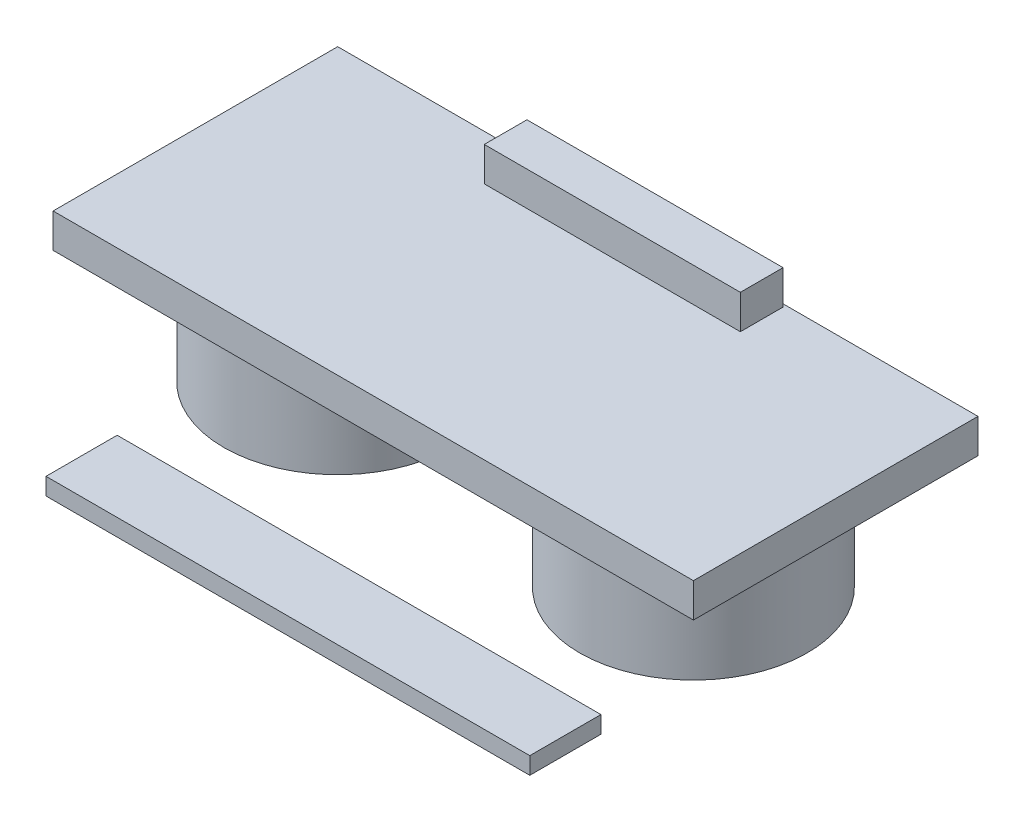
ISO-10303-21;
HEADER;
FILE_DESCRIPTION(('STEP AP214'),'2;1');
FILE_NAME('part.step','',(''),(''),'','','');
FILE_SCHEMA(('AUTOMOTIVE_DESIGN { 1 0 10303 214 1 1 1 1 }'));
ENDSEC;
DATA;
#1=APPLICATION_CONTEXT('core data for automotive mechanical design processes');
#2=APPLICATION_PROTOCOL_DEFINITION('international standard','automotive_design',2000,#1);
#3=PRODUCT_CONTEXT('',#1,'mechanical');
#4=PRODUCT('Part','Part','',(#3));
#5=PRODUCT_RELATED_PRODUCT_CATEGORY('part','',(#4));
#6=PRODUCT_DEFINITION_FORMATION('','',#4);
#7=PRODUCT_DEFINITION_CONTEXT('part definition',#1,'design');
#8=PRODUCT_DEFINITION('design','',#6,#7);
#9=PRODUCT_DEFINITION_SHAPE('','',#8);
#10=(LENGTH_UNIT() NAMED_UNIT(*) SI_UNIT(.MILLI.,.METRE.));
#11=(NAMED_UNIT(*) PLANE_ANGLE_UNIT() SI_UNIT($,.RADIAN.));
#12=(NAMED_UNIT(*) SI_UNIT($,.STERADIAN.) SOLID_ANGLE_UNIT());
#13=UNCERTAINTY_MEASURE_WITH_UNIT(LENGTH_MEASURE(1.E-05),#10,'distance_accuracy_value','');
#14=(GEOMETRIC_REPRESENTATION_CONTEXT(3) GLOBAL_UNCERTAINTY_ASSIGNED_CONTEXT((#13)) GLOBAL_UNIT_ASSIGNED_CONTEXT((#10,
#11,#12)) REPRESENTATION_CONTEXT('',''));
#15=CARTESIAN_POINT('',(0.,0.,0.));
#16=DIRECTION('',(0.,0.,1.));
#17=DIRECTION('',(1.,0.,0.));
#18=AXIS2_PLACEMENT_3D('',#15,#16,#17);
#19=CARTESIAN_POINT('',(17.,-10.4,16.));
#20=DIRECTION('',(-1.,0.,0.));
#21=DIRECTION('',(0.,0.,1.));
#22=AXIS2_PLACEMENT_3D('',#19,#20,#21);
#23=PLANE('',#22);
#24=DIRECTION('',(0.,1.,0.));
#25=VECTOR('',#24,1.);
#26=CARTESIAN_POINT('',(17.,-10.4,11.));
#27=LINE('',#26,#25);
#28=CARTESIAN_POINT('',(17.,-10.4,11.));
#29=VERTEX_POINT('',#28);
#30=CARTESIAN_POINT('',(17.,-9.2,11.));
#31=VERTEX_POINT('',#30);
#32=EDGE_CURVE('E109',#29,#31,#27,.T.);
#33=ORIENTED_EDGE('',*,*,#32,.T.);
#34=DIRECTION('',(0.,0.,-1.));
#35=VECTOR('',#34,1.);
#36=CARTESIAN_POINT('',(17.,-9.2,16.));
#37=LINE('',#36,#35);
#38=CARTESIAN_POINT('',(17.,-9.2,16.));
#39=VERTEX_POINT('',#38);
#40=EDGE_CURVE('E12',#39,#31,#37,.T.);
#41=ORIENTED_EDGE('',*,*,#40,.F.);
#42=DIRECTION('',(0.,1.,0.));
#43=VECTOR('',#42,1.);
#44=CARTESIAN_POINT('',(17.,-10.4,16.));
#45=LINE('',#44,#43);
#46=CARTESIAN_POINT('',(17.,-10.4,16.));
#47=VERTEX_POINT('',#46);
#48=EDGE_CURVE('E97',#47,#39,#45,.T.);
#49=ORIENTED_EDGE('',*,*,#48,.F.);
#50=DIRECTION('',(0.,0.,-1.));
#51=VECTOR('',#50,1.);
#52=CARTESIAN_POINT('',(17.,-10.4,16.));
#53=LINE('',#52,#51);
#54=EDGE_CURVE('E105',#47,#29,#53,.T.);
#55=ORIENTED_EDGE('',*,*,#54,.T.);
#56=EDGE_LOOP('',(#33,#41,#49,#55));
#57=FACE_BOUND('',#56,.T.);
#58=ADVANCED_FACE('F46',(#57),#23,.F.);
#59=CARTESIAN_POINT('',(-17.,-9.2,16.));
#60=DIRECTION('',(0.,-1.,0.));
#61=DIRECTION('',(0.,0.,-1.));
#62=AXIS2_PLACEMENT_3D('',#59,#60,#61);
#63=PLANE('',#62);
#64=DIRECTION('',(-1.,0.,0.));
#65=VECTOR('',#64,1.);
#66=CARTESIAN_POINT('',(-17.,-9.2,11.));
#67=LINE('',#66,#65);
#68=CARTESIAN_POINT('',(-17.,-9.2,11.));
#69=VERTEX_POINT('',#68);
#70=EDGE_CURVE('E101',#31,#69,#67,.T.);
#71=ORIENTED_EDGE('',*,*,#70,.T.);
#72=DIRECTION('',(0.,0.,-1.));
#73=VECTOR('',#72,1.);
#74=CARTESIAN_POINT('',(-17.,-9.2,16.));
#75=LINE('',#74,#73);
#76=CARTESIAN_POINT('',(-17.,-9.2,16.));
#77=VERTEX_POINT('',#76);
#78=EDGE_CURVE('E54',#77,#69,#75,.T.);
#79=ORIENTED_EDGE('',*,*,#78,.F.);
#80=DIRECTION('',(-1.,0.,0.));
#81=VECTOR('',#80,1.);
#82=CARTESIAN_POINT('',(-17.,-9.2,16.));
#83=LINE('',#82,#81);
#84=EDGE_CURVE('E92',#39,#77,#83,.T.);
#85=ORIENTED_EDGE('',*,*,#84,.F.);
#86=ORIENTED_EDGE('',*,*,#40,.T.);
#87=EDGE_LOOP('',(#71,#79,#85,#86));
#88=FACE_BOUND('',#87,.T.);
#89=ADVANCED_FACE('F100',(#88),#63,.F.);
#90=CARTESIAN_POINT('',(-17.,-10.4,16.));
#91=DIRECTION('',(1.,0.,0.));
#92=DIRECTION('',(0.,0.,-1.));
#93=AXIS2_PLACEMENT_3D('',#90,#91,#92);
#94=PLANE('',#93);
#95=DIRECTION('',(0.,-1.,0.));
#96=VECTOR('',#95,1.);
#97=CARTESIAN_POINT('',(-17.,-10.4,11.));
#98=LINE('',#97,#96);
#99=CARTESIAN_POINT('',(-17.,-10.4,11.));
#100=VERTEX_POINT('',#99);
#101=EDGE_CURVE('E79',#69,#100,#98,.T.);
#102=ORIENTED_EDGE('',*,*,#101,.T.);
#103=DIRECTION('',(0.,0.,-1.));
#104=VECTOR('',#103,1.);
#105=CARTESIAN_POINT('',(-17.,-10.4,16.));
#106=LINE('',#105,#104);
#107=CARTESIAN_POINT('',(-17.,-10.4,16.));
#108=VERTEX_POINT('',#107);
#109=EDGE_CURVE('E102',#108,#100,#106,.T.);
#110=ORIENTED_EDGE('',*,*,#109,.F.);
#111=DIRECTION('',(0.,-1.,0.));
#112=VECTOR('',#111,1.);
#113=CARTESIAN_POINT('',(-17.,-10.4,16.));
#114=LINE('',#113,#112);
#115=EDGE_CURVE('E95',#77,#108,#114,.T.);
#116=ORIENTED_EDGE('',*,*,#115,.F.);
#117=ORIENTED_EDGE('',*,*,#78,.T.);
#118=EDGE_LOOP('',(#102,#110,#116,#117));
#119=FACE_BOUND('',#118,.T.);
#120=ADVANCED_FACE('F103',(#119),#94,.F.);
#121=CARTESIAN_POINT('',(-17.,-10.4,16.));
#122=DIRECTION('',(0.,1.,0.));
#123=DIRECTION('',(0.,0.,1.));
#124=AXIS2_PLACEMENT_3D('',#121,#122,#123);
#125=PLANE('',#124);
#126=DIRECTION('',(1.,0.,0.));
#127=VECTOR('',#126,1.);
#128=CARTESIAN_POINT('',(-17.,-10.4,11.));
#129=LINE('',#128,#127);
#130=EDGE_CURVE('E85',#100,#29,#129,.T.);
#131=ORIENTED_EDGE('',*,*,#130,.T.);
#132=ORIENTED_EDGE('',*,*,#54,.F.);
#133=DIRECTION('',(1.,0.,0.));
#134=VECTOR('',#133,1.);
#135=CARTESIAN_POINT('',(-17.,-10.4,16.));
#136=LINE('',#135,#134);
#137=EDGE_CURVE('E62',#108,#47,#136,.T.);
#138=ORIENTED_EDGE('',*,*,#137,.F.);
#139=ORIENTED_EDGE('',*,*,#109,.T.);
#140=EDGE_LOOP('',(#131,#132,#138,#139));
#141=FACE_BOUND('',#140,.T.);
#142=ADVANCED_FACE('F116',(#141),#125,.F.);
#143=CARTESIAN_POINT('',(0.,0.,16.));
#144=DIRECTION('',(0.,0.,-1.));
#145=DIRECTION('',(-1.,0.,0.));
#146=AXIS2_PLACEMENT_3D('',#143,#144,#145);
#147=PLANE('',#146);
#148=ORIENTED_EDGE('',*,*,#48,.T.);
#149=ORIENTED_EDGE('',*,*,#84,.T.);
#150=ORIENTED_EDGE('',*,*,#115,.T.);
#151=ORIENTED_EDGE('',*,*,#137,.T.);
#152=EDGE_LOOP('',(#148,#149,#150,#151));
#153=FACE_BOUND('',#152,.T.);
#154=ADVANCED_FACE('F93',(#153),#147,.F.);
#155=CARTESIAN_POINT('',(0.,0.,11.));
#156=DIRECTION('',(0.,0.,-1.));
#157=DIRECTION('',(-1.,0.,0.));
#158=AXIS2_PLACEMENT_3D('',#155,#156,#157);
#159=PLANE('',#158);
#160=ORIENTED_EDGE('',*,*,#32,.F.);
#161=ORIENTED_EDGE('',*,*,#130,.F.);
#162=ORIENTED_EDGE('',*,*,#101,.F.);
#163=ORIENTED_EDGE('',*,*,#70,.F.);
#164=EDGE_LOOP('',(#160,#161,#162,#163));
#165=FACE_BOUND('',#164,.T.);
#166=ADVANCED_FACE('F119',(#165),#159,.T.);
#167=CLOSED_SHELL('',(#58,#89,#120,#142,#154,#166));
#168=MANIFOLD_SOLID_BREP('B2',#167);
#169=CARTESIAN_POINT('',(9.,0.4,-6.8));
#170=DIRECTION('',(-1.,0.,0.));
#171=DIRECTION('',(0.,0.,1.));
#172=AXIS2_PLACEMENT_3D('',#169,#170,#171);
#173=PLANE('',#172);
#174=DIRECTION('',(0.,1.,0.));
#175=VECTOR('',#174,1.);
#176=CARTESIAN_POINT('',(9.,0.4,-9.8));
#177=LINE('',#176,#175);
#178=CARTESIAN_POINT('',(9.,0.4,-9.8));
#179=VERTEX_POINT('',#178);
#180=CARTESIAN_POINT('',(9.,3.6,-9.8));
#181=VERTEX_POINT('',#180);
#182=EDGE_CURVE('E241',#179,#181,#177,.T.);
#183=ORIENTED_EDGE('',*,*,#182,.T.);
#184=DIRECTION('',(0.,0.,-1.));
#185=VECTOR('',#184,1.);
#186=CARTESIAN_POINT('',(9.,3.6,-6.8));
#187=LINE('',#186,#185);
#188=CARTESIAN_POINT('',(9.,3.6,-6.8));
#189=VERTEX_POINT('',#188);
#190=EDGE_CURVE('E44',#189,#181,#187,.T.);
#191=ORIENTED_EDGE('',*,*,#190,.F.);
#192=DIRECTION('',(0.,1.,0.));
#193=VECTOR('',#192,1.);
#194=CARTESIAN_POINT('',(9.,0.4,-6.8));
#195=LINE('',#194,#193);
#196=CARTESIAN_POINT('',(9.,0.4,-6.8));
#197=VERTEX_POINT('',#196);
#198=EDGE_CURVE('E229',#197,#189,#195,.T.);
#199=ORIENTED_EDGE('',*,*,#198,.F.);
#200=DIRECTION('',(0.,0.,-1.));
#201=VECTOR('',#200,1.);
#202=CARTESIAN_POINT('',(9.,0.4,-6.8));
#203=LINE('',#202,#201);
#204=EDGE_CURVE('E237',#197,#179,#203,.T.);
#205=ORIENTED_EDGE('',*,*,#204,.T.);
#206=EDGE_LOOP('',(#183,#191,#199,#205));
#207=FACE_BOUND('',#206,.T.);
#208=ADVANCED_FACE('F178',(#207),#173,.F.);
#209=CARTESIAN_POINT('',(-9.,3.6,-6.8));
#210=DIRECTION('',(0.,-1.,0.));
#211=DIRECTION('',(0.,0.,-1.));
#212=AXIS2_PLACEMENT_3D('',#209,#210,#211);
#213=PLANE('',#212);
#214=DIRECTION('',(-1.,0.,0.));
#215=VECTOR('',#214,1.);
#216=CARTESIAN_POINT('',(-9.,3.6,-9.8));
#217=LINE('',#216,#215);
#218=CARTESIAN_POINT('',(-9.,3.6,-9.8));
#219=VERTEX_POINT('',#218);
#220=EDGE_CURVE('E233',#181,#219,#217,.T.);
#221=ORIENTED_EDGE('',*,*,#220,.T.);
#222=DIRECTION('',(0.,0.,-1.));
#223=VECTOR('',#222,1.);
#224=CARTESIAN_POINT('',(-9.,3.6,-6.8));
#225=LINE('',#224,#223);
#226=CARTESIAN_POINT('',(-9.,3.6,-6.8));
#227=VERTEX_POINT('',#226);
#228=EDGE_CURVE('E186',#227,#219,#225,.T.);
#229=ORIENTED_EDGE('',*,*,#228,.F.);
#230=DIRECTION('',(-1.,0.,0.));
#231=VECTOR('',#230,1.);
#232=CARTESIAN_POINT('',(-9.,3.6,-6.8));
#233=LINE('',#232,#231);
#234=EDGE_CURVE('E224',#189,#227,#233,.T.);
#235=ORIENTED_EDGE('',*,*,#234,.F.);
#236=ORIENTED_EDGE('',*,*,#190,.T.);
#237=EDGE_LOOP('',(#221,#229,#235,#236));
#238=FACE_BOUND('',#237,.T.);
#239=ADVANCED_FACE('F232',(#238),#213,.F.);
#240=CARTESIAN_POINT('',(-9.,0.4,-6.8));
#241=DIRECTION('',(1.,0.,0.));
#242=DIRECTION('',(0.,0.,-1.));
#243=AXIS2_PLACEMENT_3D('',#240,#241,#242);
#244=PLANE('',#243);
#245=DIRECTION('',(0.,-1.,0.));
#246=VECTOR('',#245,1.);
#247=CARTESIAN_POINT('',(-9.,0.4,-9.8));
#248=LINE('',#247,#246);
#249=CARTESIAN_POINT('',(-9.,0.4,-9.8));
#250=VERTEX_POINT('',#249);
#251=EDGE_CURVE('E211',#219,#250,#248,.T.);
#252=ORIENTED_EDGE('',*,*,#251,.T.);
#253=DIRECTION('',(0.,0.,-1.));
#254=VECTOR('',#253,1.);
#255=CARTESIAN_POINT('',(-9.,0.4,-6.8));
#256=LINE('',#255,#254);
#257=CARTESIAN_POINT('',(-9.,0.4,-6.8));
#258=VERTEX_POINT('',#257);
#259=EDGE_CURVE('E234',#258,#250,#256,.T.);
#260=ORIENTED_EDGE('',*,*,#259,.F.);
#261=DIRECTION('',(0.,-1.,0.));
#262=VECTOR('',#261,1.);
#263=CARTESIAN_POINT('',(-9.,0.4,-6.8));
#264=LINE('',#263,#262);
#265=EDGE_CURVE('E227',#227,#258,#264,.T.);
#266=ORIENTED_EDGE('',*,*,#265,.F.);
#267=ORIENTED_EDGE('',*,*,#228,.T.);
#268=EDGE_LOOP('',(#252,#260,#266,#267));
#269=FACE_BOUND('',#268,.T.);
#270=ADVANCED_FACE('F235',(#269),#244,.F.);
#271=CARTESIAN_POINT('',(-9.,0.4,-6.8));
#272=DIRECTION('',(0.,1.,0.));
#273=DIRECTION('',(0.,0.,1.));
#274=AXIS2_PLACEMENT_3D('',#271,#272,#273);
#275=PLANE('',#274);
#276=DIRECTION('',(1.,0.,0.));
#277=VECTOR('',#276,1.);
#278=CARTESIAN_POINT('',(-9.,0.4,-9.8));
#279=LINE('',#278,#277);
#280=EDGE_CURVE('E217',#250,#179,#279,.T.);
#281=ORIENTED_EDGE('',*,*,#280,.T.);
#282=ORIENTED_EDGE('',*,*,#204,.F.);
#283=DIRECTION('',(1.,0.,0.));
#284=VECTOR('',#283,1.);
#285=CARTESIAN_POINT('',(-9.,0.4,-6.8));
#286=LINE('',#285,#284);
#287=EDGE_CURVE('E194',#258,#197,#286,.T.);
#288=ORIENTED_EDGE('',*,*,#287,.F.);
#289=ORIENTED_EDGE('',*,*,#259,.T.);
#290=EDGE_LOOP('',(#281,#282,#288,#289));
#291=FACE_BOUND('',#290,.T.);
#292=ADVANCED_FACE('F248',(#291),#275,.F.);
#293=CARTESIAN_POINT('',(0.,0.,-6.8));
#294=DIRECTION('',(0.,0.,-1.));
#295=DIRECTION('',(-1.,0.,0.));
#296=AXIS2_PLACEMENT_3D('',#293,#294,#295);
#297=PLANE('',#296);
#298=ORIENTED_EDGE('',*,*,#198,.T.);
#299=ORIENTED_EDGE('',*,*,#234,.T.);
#300=ORIENTED_EDGE('',*,*,#265,.T.);
#301=ORIENTED_EDGE('',*,*,#287,.T.);
#302=EDGE_LOOP('',(#298,#299,#300,#301));
#303=FACE_BOUND('',#302,.T.);
#304=ADVANCED_FACE('F225',(#303),#297,.F.);
#305=CARTESIAN_POINT('',(0.,0.,-9.8));
#306=DIRECTION('',(0.,0.,-1.));
#307=DIRECTION('',(-1.,0.,0.));
#308=AXIS2_PLACEMENT_3D('',#305,#306,#307);
#309=PLANE('',#308);
#310=ORIENTED_EDGE('',*,*,#182,.F.);
#311=ORIENTED_EDGE('',*,*,#280,.F.);
#312=ORIENTED_EDGE('',*,*,#251,.F.);
#313=ORIENTED_EDGE('',*,*,#220,.F.);
#314=EDGE_LOOP('',(#310,#311,#312,#313));
#315=FACE_BOUND('',#314,.T.);
#316=ADVANCED_FACE('F251',(#315),#309,.T.);
#317=CLOSED_SHELL('',(#208,#239,#270,#292,#304,#316));
#318=MANIFOLD_SOLID_BREP('B6',#317);
#319=CARTESIAN_POINT('',(12.5,-1.2,0.));
#320=DIRECTION('',(0.,-1.,0.));
#321=DIRECTION('',(0.,0.,-1.));
#322=AXIS2_PLACEMENT_3D('',#319,#320,#321);
#323=CYLINDRICAL_SURFACE('',#322,8.);
#324=CARTESIAN_POINT('',(12.5,-1.2,0.));
#325=DIRECTION('',(0.,1.,0.));
#326=DIRECTION('',(0.,0.,1.));
#327=AXIS2_PLACEMENT_3D('',#324,#325,#326);
#328=CIRCLE('',#327,8.);
#329=CARTESIAN_POINT('',(12.5,-1.2,8.));
#330=VERTEX_POINT('',#329);
#331=EDGE_CURVE('E177',#330,#330,#328,.T.);
#332=ORIENTED_EDGE('',*,*,#331,.F.);
#333=EDGE_LOOP('',(#332));
#334=FACE_BOUND('',#333,.T.);
#335=CARTESIAN_POINT('',(12.5,-9.2,0.));
#336=DIRECTION('',(0.,1.,0.));
#337=DIRECTION('',(0.,0.,1.));
#338=AXIS2_PLACEMENT_3D('',#335,#336,#337);
#339=CIRCLE('',#338,8.);
#340=CARTESIAN_POINT('',(12.5,-9.2,8.));
#341=VERTEX_POINT('',#340);
#342=EDGE_CURVE('E313',#341,#341,#339,.T.);
#343=ORIENTED_EDGE('',*,*,#342,.T.);
#344=EDGE_LOOP('',(#343));
#345=FACE_BOUND('',#344,.T.);
#346=ADVANCED_FACE('F310',(#334,#345),#323,.T.);
#347=CARTESIAN_POINT('',(12.5,-1.2,0.));
#348=DIRECTION('',(0.,1.,0.));
#349=DIRECTION('',(0.,0.,1.));
#350=AXIS2_PLACEMENT_3D('',#347,#348,#349);
#351=PLANE('',#350);
#352=ORIENTED_EDGE('',*,*,#331,.T.);
#353=EDGE_LOOP('',(#352));
#354=FACE_BOUND('',#353,.T.);
#355=ADVANCED_FACE('F325',(#354),#351,.T.);
#356=CARTESIAN_POINT('',(12.5,-9.2,0.));
#357=DIRECTION('',(0.,1.,0.));
#358=DIRECTION('',(0.,0.,1.));
#359=AXIS2_PLACEMENT_3D('',#356,#357,#358);
#360=PLANE('',#359);
#361=ORIENTED_EDGE('',*,*,#342,.F.);
#362=EDGE_LOOP('',(#361));
#363=FACE_BOUND('',#362,.T.);
#364=ADVANCED_FACE('F323',(#363),#360,.F.);
#365=CLOSED_SHELL('',(#346,#355,#364));
#366=MANIFOLD_SOLID_BREP('B38',#365);
#367=CARTESIAN_POINT('',(-12.5,-1.2,0.));
#368=DIRECTION('',(0.,-1.,0.));
#369=DIRECTION('',(0.,0.,-1.));
#370=AXIS2_PLACEMENT_3D('',#367,#368,#369);
#371=CYLINDRICAL_SURFACE('',#370,8.);
#372=CARTESIAN_POINT('',(-12.5,-1.2,0.));
#373=DIRECTION('',(0.,1.,0.));
#374=DIRECTION('',(0.,0.,1.));
#375=AXIS2_PLACEMENT_3D('',#372,#373,#374);
#376=CIRCLE('',#375,8.);
#377=CARTESIAN_POINT('',(-12.5,-1.2,8.));
#378=VERTEX_POINT('',#377);
#379=EDGE_CURVE('E309',#378,#378,#376,.T.);
#380=ORIENTED_EDGE('',*,*,#379,.F.);
#381=EDGE_LOOP('',(#380));
#382=FACE_BOUND('',#381,.T.);
#383=CARTESIAN_POINT('',(-12.5,-9.2,0.));
#384=DIRECTION('',(0.,1.,0.));
#385=DIRECTION('',(0.,0.,1.));
#386=AXIS2_PLACEMENT_3D('',#383,#384,#385);
#387=CIRCLE('',#386,8.);
#388=CARTESIAN_POINT('',(-12.5,-9.2,8.));
#389=VERTEX_POINT('',#388);
#390=EDGE_CURVE('E363',#389,#389,#387,.T.);
#391=ORIENTED_EDGE('',*,*,#390,.T.);
#392=EDGE_LOOP('',(#391));
#393=FACE_BOUND('',#392,.T.);
#394=ADVANCED_FACE('F360',(#382,#393),#371,.T.);
#395=CARTESIAN_POINT('',(-12.5,-1.2,0.));
#396=DIRECTION('',(0.,1.,0.));
#397=DIRECTION('',(0.,0.,1.));
#398=AXIS2_PLACEMENT_3D('',#395,#396,#397);
#399=PLANE('',#398);
#400=ORIENTED_EDGE('',*,*,#379,.T.);
#401=EDGE_LOOP('',(#400));
#402=FACE_BOUND('',#401,.T.);
#403=ADVANCED_FACE('F375',(#402),#399,.T.);
#404=CARTESIAN_POINT('',(-12.5,-9.2,0.));
#405=DIRECTION('',(0.,1.,0.));
#406=DIRECTION('',(0.,0.,1.));
#407=AXIS2_PLACEMENT_3D('',#404,#405,#406);
#408=PLANE('',#407);
#409=ORIENTED_EDGE('',*,*,#390,.F.);
#410=EDGE_LOOP('',(#409));
#411=FACE_BOUND('',#410,.T.);
#412=ADVANCED_FACE('F373',(#411),#408,.F.);
#413=CLOSED_SHELL('',(#394,#403,#412));
#414=MANIFOLD_SOLID_BREP('B172',#413);
#415=CARTESIAN_POINT('',(22.5,-1.2,10.));
#416=DIRECTION('',(-1.,0.,0.));
#417=DIRECTION('',(0.,0.,1.));
#418=AXIS2_PLACEMENT_3D('',#415,#416,#417);
#419=PLANE('',#418);
#420=DIRECTION('',(0.,1.,0.));
#421=VECTOR('',#420,1.);
#422=CARTESIAN_POINT('',(22.5,-1.2,-10.));
#423=LINE('',#422,#421);
#424=CARTESIAN_POINT('',(22.5,-1.2,-10.));
#425=VERTEX_POINT('',#424);
#426=CARTESIAN_POINT('',(22.5,1.2,-10.));
#427=VERTEX_POINT('',#426);
#428=EDGE_CURVE('E464',#425,#427,#423,.T.);
#429=ORIENTED_EDGE('',*,*,#428,.T.);
#430=DIRECTION('',(0.,0.,-1.));
#431=VECTOR('',#430,1.);
#432=CARTESIAN_POINT('',(22.5,1.2,10.));
#433=LINE('',#432,#431);
#434=CARTESIAN_POINT('',(22.5,1.2,10.));
#435=VERTEX_POINT('',#434);
#436=EDGE_CURVE('E358',#435,#427,#433,.T.);
#437=ORIENTED_EDGE('',*,*,#436,.F.);
#438=DIRECTION('',(0.,1.,0.));
#439=VECTOR('',#438,1.);
#440=CARTESIAN_POINT('',(22.5,-1.2,10.));
#441=LINE('',#440,#439);
#442=CARTESIAN_POINT('',(22.5,-1.2,10.));
#443=VERTEX_POINT('',#442);
#444=EDGE_CURVE('E452',#443,#435,#441,.T.);
#445=ORIENTED_EDGE('',*,*,#444,.F.);
#446=DIRECTION('',(0.,0.,-1.));
#447=VECTOR('',#446,1.);
#448=CARTESIAN_POINT('',(22.5,-1.2,10.));
#449=LINE('',#448,#447);
#450=EDGE_CURVE('E460',#443,#425,#449,.T.);
#451=ORIENTED_EDGE('',*,*,#450,.T.);
#452=EDGE_LOOP('',(#429,#437,#445,#451));
#453=FACE_BOUND('',#452,.T.);
#454=ADVANCED_FACE('F401',(#453),#419,.F.);
#455=CARTESIAN_POINT('',(-22.5,1.2,10.));
#456=DIRECTION('',(0.,-1.,0.));
#457=DIRECTION('',(0.,0.,-1.));
#458=AXIS2_PLACEMENT_3D('',#455,#456,#457);
#459=PLANE('',#458);
#460=DIRECTION('',(-1.,0.,0.));
#461=VECTOR('',#460,1.);
#462=CARTESIAN_POINT('',(-22.5,1.2,-10.));
#463=LINE('',#462,#461);
#464=CARTESIAN_POINT('',(-22.5,1.2,-10.));
#465=VERTEX_POINT('',#464);
#466=EDGE_CURVE('E456',#427,#465,#463,.T.);
#467=ORIENTED_EDGE('',*,*,#466,.T.);
#468=DIRECTION('',(0.,0.,-1.));
#469=VECTOR('',#468,1.);
#470=CARTESIAN_POINT('',(-22.5,1.2,10.));
#471=LINE('',#470,#469);
#472=CARTESIAN_POINT('',(-22.5,1.2,10.));
#473=VERTEX_POINT('',#472);
#474=EDGE_CURVE('E409',#473,#465,#471,.T.);
#475=ORIENTED_EDGE('',*,*,#474,.F.);
#476=DIRECTION('',(-1.,0.,0.));
#477=VECTOR('',#476,1.);
#478=CARTESIAN_POINT('',(-22.5,1.2,10.));
#479=LINE('',#478,#477);
#480=EDGE_CURVE('E447',#435,#473,#479,.T.);
#481=ORIENTED_EDGE('',*,*,#480,.F.);
#482=ORIENTED_EDGE('',*,*,#436,.T.);
#483=EDGE_LOOP('',(#467,#475,#481,#482));
#484=FACE_BOUND('',#483,.T.);
#485=ADVANCED_FACE('F455',(#484),#459,.F.);
#486=CARTESIAN_POINT('',(-22.5,-1.2,10.));
#487=DIRECTION('',(1.,0.,0.));
#488=DIRECTION('',(0.,0.,-1.));
#489=AXIS2_PLACEMENT_3D('',#486,#487,#488);
#490=PLANE('',#489);
#491=DIRECTION('',(0.,-1.,0.));
#492=VECTOR('',#491,1.);
#493=CARTESIAN_POINT('',(-22.5,-1.2,-10.));
#494=LINE('',#493,#492);
#495=CARTESIAN_POINT('',(-22.5,-1.2,-10.));
#496=VERTEX_POINT('',#495);
#497=EDGE_CURVE('E434',#465,#496,#494,.T.);
#498=ORIENTED_EDGE('',*,*,#497,.T.);
#499=DIRECTION('',(0.,0.,-1.));
#500=VECTOR('',#499,1.);
#501=CARTESIAN_POINT('',(-22.5,-1.2,10.));
#502=LINE('',#501,#500);
#503=CARTESIAN_POINT('',(-22.5,-1.2,10.));
#504=VERTEX_POINT('',#503);
#505=EDGE_CURVE('E457',#504,#496,#502,.T.);
#506=ORIENTED_EDGE('',*,*,#505,.F.);
#507=DIRECTION('',(0.,-1.,0.));
#508=VECTOR('',#507,1.);
#509=CARTESIAN_POINT('',(-22.5,-1.2,10.));
#510=LINE('',#509,#508);
#511=EDGE_CURVE('E450',#473,#504,#510,.T.);
#512=ORIENTED_EDGE('',*,*,#511,.F.);
#513=ORIENTED_EDGE('',*,*,#474,.T.);
#514=EDGE_LOOP('',(#498,#506,#512,#513));
#515=FACE_BOUND('',#514,.T.);
#516=ADVANCED_FACE('F458',(#515),#490,.F.);
#517=CARTESIAN_POINT('',(-22.5,-1.2,10.));
#518=DIRECTION('',(0.,1.,0.));
#519=DIRECTION('',(0.,0.,1.));
#520=AXIS2_PLACEMENT_3D('',#517,#518,#519);
#521=PLANE('',#520);
#522=DIRECTION('',(1.,0.,0.));
#523=VECTOR('',#522,1.);
#524=CARTESIAN_POINT('',(-22.5,-1.2,-10.));
#525=LINE('',#524,#523);
#526=EDGE_CURVE('E440',#496,#425,#525,.T.);
#527=ORIENTED_EDGE('',*,*,#526,.T.);
#528=ORIENTED_EDGE('',*,*,#450,.F.);
#529=DIRECTION('',(1.,0.,0.));
#530=VECTOR('',#529,1.);
#531=CARTESIAN_POINT('',(-22.5,-1.2,10.));
#532=LINE('',#531,#530);
#533=EDGE_CURVE('E417',#504,#443,#532,.T.);
#534=ORIENTED_EDGE('',*,*,#533,.F.);
#535=ORIENTED_EDGE('',*,*,#505,.T.);
#536=EDGE_LOOP('',(#527,#528,#534,#535));
#537=FACE_BOUND('',#536,.T.);
#538=ADVANCED_FACE('F471',(#537),#521,.F.);
#539=CARTESIAN_POINT('',(0.,0.,10.));
#540=DIRECTION('',(0.,0.,-1.));
#541=DIRECTION('',(-1.,0.,0.));
#542=AXIS2_PLACEMENT_3D('',#539,#540,#541);
#543=PLANE('',#542);
#544=ORIENTED_EDGE('',*,*,#444,.T.);
#545=ORIENTED_EDGE('',*,*,#480,.T.);
#546=ORIENTED_EDGE('',*,*,#511,.T.);
#547=ORIENTED_EDGE('',*,*,#533,.T.);
#548=EDGE_LOOP('',(#544,#545,#546,#547));
#549=FACE_BOUND('',#548,.T.);
#550=ADVANCED_FACE('F448',(#549),#543,.F.);
#551=CARTESIAN_POINT('',(0.,0.,-10.));
#552=DIRECTION('',(0.,0.,-1.));
#553=DIRECTION('',(-1.,0.,0.));
#554=AXIS2_PLACEMENT_3D('',#551,#552,#553);
#555=PLANE('',#554);
#556=ORIENTED_EDGE('',*,*,#428,.F.);
#557=ORIENTED_EDGE('',*,*,#526,.F.);
#558=ORIENTED_EDGE('',*,*,#497,.F.);
#559=ORIENTED_EDGE('',*,*,#466,.F.);
#560=EDGE_LOOP('',(#556,#557,#558,#559));
#561=FACE_BOUND('',#560,.T.);
#562=ADVANCED_FACE('F474',(#561),#555,.T.);
#563=CLOSED_SHELL('',(#454,#485,#516,#538,#550,#562));
#564=MANIFOLD_SOLID_BREP('B304',#563);
#565=ADVANCED_BREP_SHAPE_REPRESENTATION('',(#18,#168,#318,#366,#414,#564),#14);
#566=SHAPE_DEFINITION_REPRESENTATION(#9,#565);
ENDSEC;
END-ISO-10303-21;
